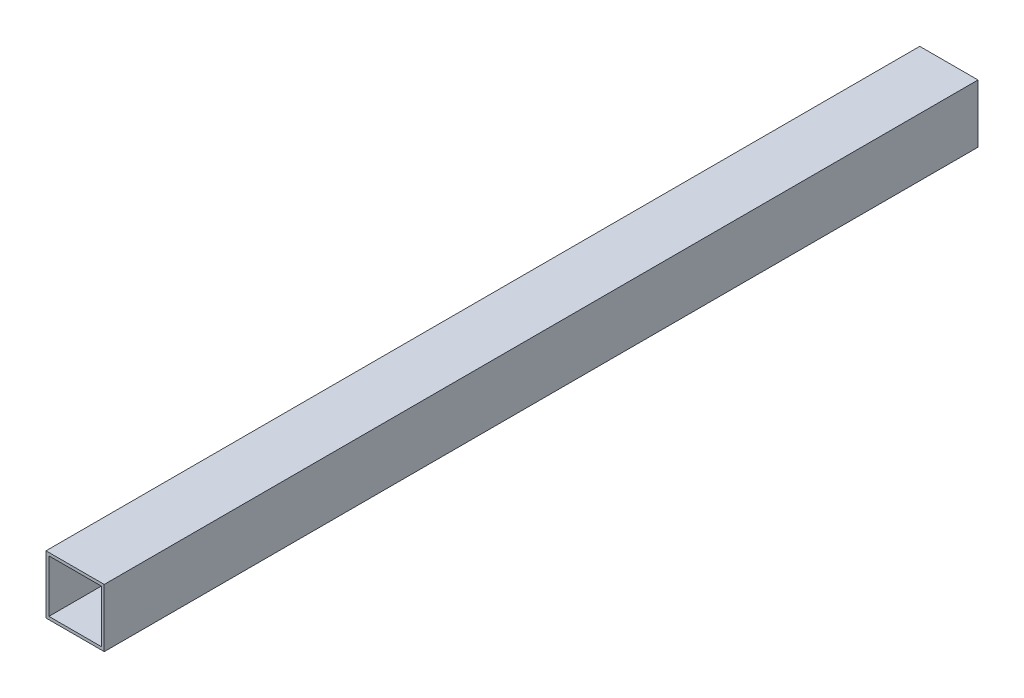
ISO-10303-21;
HEADER;
FILE_DESCRIPTION(('STEP AP214'),'2;1');
FILE_NAME('part.step','',(''),(''),'','','');
FILE_SCHEMA(('AUTOMOTIVE_DESIGN { 1 0 10303 214 1 1 1 1 }'));
ENDSEC;
DATA;
#1=APPLICATION_CONTEXT('core data for automotive mechanical design processes');
#2=APPLICATION_PROTOCOL_DEFINITION('international standard','automotive_design',2000,#1);
#3=PRODUCT_CONTEXT('',#1,'mechanical');
#4=PRODUCT('Part','Part','',(#3));
#5=PRODUCT_RELATED_PRODUCT_CATEGORY('part','',(#4));
#6=PRODUCT_DEFINITION_FORMATION('','',#4);
#7=PRODUCT_DEFINITION_CONTEXT('part definition',#1,'design');
#8=PRODUCT_DEFINITION('design','',#6,#7);
#9=PRODUCT_DEFINITION_SHAPE('','',#8);
#10=(LENGTH_UNIT() NAMED_UNIT(*) SI_UNIT(.MILLI.,.METRE.));
#11=(NAMED_UNIT(*) PLANE_ANGLE_UNIT() SI_UNIT($,.RADIAN.));
#12=(NAMED_UNIT(*) SI_UNIT($,.STERADIAN.) SOLID_ANGLE_UNIT());
#13=UNCERTAINTY_MEASURE_WITH_UNIT(LENGTH_MEASURE(1.E-05),#10,'distance_accuracy_value','');
#14=(GEOMETRIC_REPRESENTATION_CONTEXT(3) GLOBAL_UNCERTAINTY_ASSIGNED_CONTEXT((#13)) GLOBAL_UNIT_ASSIGNED_CONTEXT((#10,
#11,#12)) REPRESENTATION_CONTEXT('',''));
#15=CARTESIAN_POINT('',(0.,0.,0.));
#16=DIRECTION('',(0.,0.,1.));
#17=DIRECTION('',(1.,0.,0.));
#18=AXIS2_PLACEMENT_3D('',#15,#16,#17);
#19=CARTESIAN_POINT('',(0.,0.,0.));
#20=DIRECTION('',(0.,0.,-1.));
#21=DIRECTION('',(-1.,0.,0.));
#22=AXIS2_PLACEMENT_3D('',#19,#20,#21);
#23=PLANE('',#22);
#24=DIRECTION('',(0.,1.,0.));
#25=VECTOR('',#24,1.);
#26=CARTESIAN_POINT('',(10.,-10.,0.));
#27=LINE('',#26,#25);
#28=CARTESIAN_POINT('',(10.,-10.,0.));
#29=VERTEX_POINT('',#28);
#30=CARTESIAN_POINT('',(10.,10.,0.));
#31=VERTEX_POINT('',#30);
#32=EDGE_CURVE('E121',#29,#31,#27,.T.);
#33=ORIENTED_EDGE('',*,*,#32,.F.);
#34=DIRECTION('',(1.,0.,0.));
#35=VECTOR('',#34,1.);
#36=CARTESIAN_POINT('',(-10.,-10.,0.));
#37=LINE('',#36,#35);
#38=CARTESIAN_POINT('',(-10.,-10.,0.));
#39=VERTEX_POINT('',#38);
#40=EDGE_CURVE('E69',#39,#29,#37,.T.);
#41=ORIENTED_EDGE('',*,*,#40,.F.);
#42=DIRECTION('',(0.,-1.,0.));
#43=VECTOR('',#42,1.);
#44=CARTESIAN_POINT('',(-10.,-10.,0.));
#45=LINE('',#44,#43);
#46=CARTESIAN_POINT('',(-10.,10.,0.));
#47=VERTEX_POINT('',#46);
#48=EDGE_CURVE('E185',#47,#39,#45,.T.);
#49=ORIENTED_EDGE('',*,*,#48,.F.);
#50=DIRECTION('',(-1.,0.,0.));
#51=VECTOR('',#50,1.);
#52=CARTESIAN_POINT('',(-10.,10.,0.));
#53=LINE('',#52,#51);
#54=EDGE_CURVE('E182',#31,#47,#53,.T.);
#55=ORIENTED_EDGE('',*,*,#54,.F.);
#56=EDGE_LOOP('',(#33,#41,#49,#55));
#57=FACE_BOUND('',#56,.T.);
#58=DIRECTION('',(-1.,0.,0.));
#59=VECTOR('',#58,1.);
#60=CARTESIAN_POINT('',(-9.,9.,0.));
#61=LINE('',#60,#59);
#62=CARTESIAN_POINT('',(9.,9.,0.));
#63=VERTEX_POINT('',#62);
#64=CARTESIAN_POINT('',(-9.,9.,0.));
#65=VERTEX_POINT('',#64);
#66=EDGE_CURVE('E168',#63,#65,#61,.T.);
#67=ORIENTED_EDGE('',*,*,#66,.T.);
#68=DIRECTION('',(0.,-1.,0.));
#69=VECTOR('',#68,1.);
#70=CARTESIAN_POINT('',(-9.,-9.,0.));
#71=LINE('',#70,#69);
#72=CARTESIAN_POINT('',(-9.,-9.,0.));
#73=VERTEX_POINT('',#72);
#74=EDGE_CURVE('E61',#65,#73,#71,.T.);
#75=ORIENTED_EDGE('',*,*,#74,.T.);
#76=DIRECTION('',(1.,0.,0.));
#77=VECTOR('',#76,1.);
#78=CARTESIAN_POINT('',(-9.,-9.,0.));
#79=LINE('',#78,#77);
#80=CARTESIAN_POINT('',(9.,-9.,0.));
#81=VERTEX_POINT('',#80);
#82=EDGE_CURVE('E119',#73,#81,#79,.T.);
#83=ORIENTED_EDGE('',*,*,#82,.T.);
#84=DIRECTION('',(0.,1.,0.));
#85=VECTOR('',#84,1.);
#86=CARTESIAN_POINT('',(9.,-9.,0.));
#87=LINE('',#86,#85);
#88=EDGE_CURVE('E164',#81,#63,#87,.T.);
#89=ORIENTED_EDGE('',*,*,#88,.T.);
#90=EDGE_LOOP('',(#67,#75,#83,#89));
#91=FACE_BOUND('',#90,.T.);
#92=ADVANCED_FACE('F45',(#57,#91),#23,.T.);
#93=CARTESIAN_POINT('',(10.,-10.,150.));
#94=DIRECTION('',(-1.,0.,0.));
#95=DIRECTION('',(0.,0.,1.));
#96=AXIS2_PLACEMENT_3D('',#93,#94,#95);
#97=PLANE('',#96);
#98=ORIENTED_EDGE('',*,*,#32,.T.);
#99=DIRECTION('',(0.,0.,-1.));
#100=VECTOR('',#99,1.);
#101=CARTESIAN_POINT('',(10.,10.,150.));
#102=LINE('',#101,#100);
#103=CARTESIAN_POINT('',(10.,10.,300.));
#104=VERTEX_POINT('',#103);
#105=EDGE_CURVE('E11',#104,#31,#102,.T.);
#106=ORIENTED_EDGE('',*,*,#105,.F.);
#107=DIRECTION('',(0.,1.,0.));
#108=VECTOR('',#107,1.);
#109=CARTESIAN_POINT('',(10.,10.,300.));
#110=LINE('',#109,#108);
#111=CARTESIAN_POINT('',(10.,-10.,300.));
#112=VERTEX_POINT('',#111);
#113=EDGE_CURVE('E152',#112,#104,#110,.T.);
#114=ORIENTED_EDGE('',*,*,#113,.F.);
#115=DIRECTION('',(0.,0.,-1.));
#116=VECTOR('',#115,1.);
#117=CARTESIAN_POINT('',(10.,-10.,150.));
#118=LINE('',#117,#116);
#119=EDGE_CURVE('E190',#112,#29,#118,.T.);
#120=ORIENTED_EDGE('',*,*,#119,.T.);
#121=EDGE_LOOP('',(#98,#106,#114,#120));
#122=FACE_BOUND('',#121,.T.);
#123=ADVANCED_FACE('F47',(#122),#97,.F.);
#124=CARTESIAN_POINT('',(-10.,10.,150.));
#125=DIRECTION('',(0.,-1.,0.));
#126=DIRECTION('',(0.,0.,-1.));
#127=AXIS2_PLACEMENT_3D('',#124,#125,#126);
#128=PLANE('',#127);
#129=ORIENTED_EDGE('',*,*,#54,.T.);
#130=DIRECTION('',(0.,0.,-1.));
#131=VECTOR('',#130,1.);
#132=CARTESIAN_POINT('',(-10.,10.,150.));
#133=LINE('',#132,#131);
#134=CARTESIAN_POINT('',(-10.,10.,300.));
#135=VERTEX_POINT('',#134);
#136=EDGE_CURVE('E54',#135,#47,#133,.T.);
#137=ORIENTED_EDGE('',*,*,#136,.F.);
#138=DIRECTION('',(-1.,0.,0.));
#139=VECTOR('',#138,1.);
#140=CARTESIAN_POINT('',(-10.,10.,300.));
#141=LINE('',#140,#139);
#142=EDGE_CURVE('E156',#104,#135,#141,.T.);
#143=ORIENTED_EDGE('',*,*,#142,.F.);
#144=ORIENTED_EDGE('',*,*,#105,.T.);
#145=EDGE_LOOP('',(#129,#137,#143,#144));
#146=FACE_BOUND('',#145,.T.);
#147=ADVANCED_FACE('F211',(#146),#128,.F.);
#148=CARTESIAN_POINT('',(-10.,-10.,150.));
#149=DIRECTION('',(1.,0.,0.));
#150=DIRECTION('',(0.,0.,-1.));
#151=AXIS2_PLACEMENT_3D('',#148,#149,#150);
#152=PLANE('',#151);
#153=ORIENTED_EDGE('',*,*,#48,.T.);
#154=DIRECTION('',(0.,0.,-1.));
#155=VECTOR('',#154,1.);
#156=CARTESIAN_POINT('',(-10.,-10.,150.));
#157=LINE('',#156,#155);
#158=CARTESIAN_POINT('',(-10.,-10.,300.));
#159=VERTEX_POINT('',#158);
#160=EDGE_CURVE('E193',#159,#39,#157,.T.);
#161=ORIENTED_EDGE('',*,*,#160,.F.);
#162=DIRECTION('',(0.,-1.,0.));
#163=VECTOR('',#162,1.);
#164=CARTESIAN_POINT('',(-10.,10.,300.));
#165=LINE('',#164,#163);
#166=EDGE_CURVE('E144',#135,#159,#165,.T.);
#167=ORIENTED_EDGE('',*,*,#166,.F.);
#168=ORIENTED_EDGE('',*,*,#136,.T.);
#169=EDGE_LOOP('',(#153,#161,#167,#168));
#170=FACE_BOUND('',#169,.T.);
#171=ADVANCED_FACE('F200',(#170),#152,.F.);
#172=CARTESIAN_POINT('',(-10.,-10.,150.));
#173=DIRECTION('',(0.,1.,0.));
#174=DIRECTION('',(0.,0.,1.));
#175=AXIS2_PLACEMENT_3D('',#172,#173,#174);
#176=PLANE('',#175);
#177=ORIENTED_EDGE('',*,*,#40,.T.);
#178=ORIENTED_EDGE('',*,*,#119,.F.);
#179=DIRECTION('',(1.,0.,0.));
#180=VECTOR('',#179,1.);
#181=CARTESIAN_POINT('',(-10.,-10.,300.));
#182=LINE('',#181,#180);
#183=EDGE_CURVE('E148',#159,#112,#182,.T.);
#184=ORIENTED_EDGE('',*,*,#183,.F.);
#185=ORIENTED_EDGE('',*,*,#160,.T.);
#186=EDGE_LOOP('',(#177,#178,#184,#185));
#187=FACE_BOUND('',#186,.T.);
#188=ADVANCED_FACE('F209',(#187),#176,.F.);
#189=CARTESIAN_POINT('',(-9.,-9.,150.));
#190=DIRECTION('',(1.,0.,0.));
#191=DIRECTION('',(0.,0.,-1.));
#192=AXIS2_PLACEMENT_3D('',#189,#190,#191);
#193=PLANE('',#192);
#194=ORIENTED_EDGE('',*,*,#74,.F.);
#195=DIRECTION('',(0.,0.,-1.));
#196=VECTOR('',#195,1.);
#197=CARTESIAN_POINT('',(-9.,9.,150.));
#198=LINE('',#197,#196);
#199=CARTESIAN_POINT('',(-9.,9.,300.));
#200=VERTEX_POINT('',#199);
#201=EDGE_CURVE('E127',#200,#65,#198,.T.);
#202=ORIENTED_EDGE('',*,*,#201,.F.);
#203=DIRECTION('',(0.,-1.,0.));
#204=VECTOR('',#203,1.);
#205=CARTESIAN_POINT('',(-9.,9.,300.));
#206=LINE('',#205,#204);
#207=CARTESIAN_POINT('',(-9.,-9.,300.));
#208=VERTEX_POINT('',#207);
#209=EDGE_CURVE('E125',#200,#208,#206,.T.);
#210=ORIENTED_EDGE('',*,*,#209,.T.);
#211=DIRECTION('',(0.,0.,-1.));
#212=VECTOR('',#211,1.);
#213=CARTESIAN_POINT('',(-9.,-9.,150.));
#214=LINE('',#213,#212);
#215=EDGE_CURVE('E112',#208,#73,#214,.T.);
#216=ORIENTED_EDGE('',*,*,#215,.T.);
#217=EDGE_LOOP('',(#194,#202,#210,#216));
#218=FACE_BOUND('',#217,.T.);
#219=ADVANCED_FACE('F126',(#218),#193,.T.);
#220=CARTESIAN_POINT('',(-9.,-9.,150.));
#221=DIRECTION('',(0.,1.,0.));
#222=DIRECTION('',(0.,0.,1.));
#223=AXIS2_PLACEMENT_3D('',#220,#221,#222);
#224=PLANE('',#223);
#225=ORIENTED_EDGE('',*,*,#82,.F.);
#226=ORIENTED_EDGE('',*,*,#215,.F.);
#227=DIRECTION('',(1.,0.,0.));
#228=VECTOR('',#227,1.);
#229=CARTESIAN_POINT('',(-9.,-9.,300.));
#230=LINE('',#229,#228);
#231=CARTESIAN_POINT('',(9.,-9.,300.));
#232=VERTEX_POINT('',#231);
#233=EDGE_CURVE('E116',#208,#232,#230,.T.);
#234=ORIENTED_EDGE('',*,*,#233,.T.);
#235=DIRECTION('',(0.,0.,-1.));
#236=VECTOR('',#235,1.);
#237=CARTESIAN_POINT('',(9.,-9.,150.));
#238=LINE('',#237,#236);
#239=EDGE_CURVE('E122',#232,#81,#238,.T.);
#240=ORIENTED_EDGE('',*,*,#239,.T.);
#241=EDGE_LOOP('',(#225,#226,#234,#240));
#242=FACE_BOUND('',#241,.T.);
#243=ADVANCED_FACE('F114',(#242),#224,.T.);
#244=CARTESIAN_POINT('',(9.,-9.,150.));
#245=DIRECTION('',(-1.,0.,0.));
#246=DIRECTION('',(0.,-1.,0.));
#247=AXIS2_PLACEMENT_3D('',#244,#245,#246);
#248=PLANE('',#247);
#249=ORIENTED_EDGE('',*,*,#88,.F.);
#250=ORIENTED_EDGE('',*,*,#239,.F.);
#251=DIRECTION('',(0.,1.,0.));
#252=VECTOR('',#251,1.);
#253=CARTESIAN_POINT('',(9.,9.,300.));
#254=LINE('',#253,#252);
#255=CARTESIAN_POINT('',(9.,9.,300.));
#256=VERTEX_POINT('',#255);
#257=EDGE_CURVE('E135',#232,#256,#254,.T.);
#258=ORIENTED_EDGE('',*,*,#257,.T.);
#259=DIRECTION('',(0.,0.,-1.));
#260=VECTOR('',#259,1.);
#261=CARTESIAN_POINT('',(9.,9.,150.));
#262=LINE('',#261,#260);
#263=EDGE_CURVE('E174',#256,#63,#262,.T.);
#264=ORIENTED_EDGE('',*,*,#263,.T.);
#265=EDGE_LOOP('',(#249,#250,#258,#264));
#266=FACE_BOUND('',#265,.T.);
#267=ADVANCED_FACE('F232',(#266),#248,.T.);
#268=CARTESIAN_POINT('',(-9.,9.,150.));
#269=DIRECTION('',(0.,-1.,0.));
#270=DIRECTION('',(0.,0.,-1.));
#271=AXIS2_PLACEMENT_3D('',#268,#269,#270);
#272=PLANE('',#271);
#273=ORIENTED_EDGE('',*,*,#66,.F.);
#274=ORIENTED_EDGE('',*,*,#263,.F.);
#275=DIRECTION('',(-1.,0.,0.));
#276=VECTOR('',#275,1.);
#277=CARTESIAN_POINT('',(-9.,9.,300.));
#278=LINE('',#277,#276);
#279=EDGE_CURVE('E139',#256,#200,#278,.T.);
#280=ORIENTED_EDGE('',*,*,#279,.T.);
#281=ORIENTED_EDGE('',*,*,#201,.T.);
#282=EDGE_LOOP('',(#273,#274,#280,#281));
#283=FACE_BOUND('',#282,.T.);
#284=ADVANCED_FACE('F236',(#283),#272,.T.);
#285=CARTESIAN_POINT('',(0.,0.,300.));
#286=DIRECTION('',(0.,0.,1.));
#287=DIRECTION('',(1.,0.,0.));
#288=AXIS2_PLACEMENT_3D('',#285,#286,#287);
#289=PLANE('',#288);
#290=ORIENTED_EDGE('',*,*,#166,.T.);
#291=ORIENTED_EDGE('',*,*,#183,.T.);
#292=ORIENTED_EDGE('',*,*,#113,.T.);
#293=ORIENTED_EDGE('',*,*,#142,.T.);
#294=EDGE_LOOP('',(#290,#291,#292,#293));
#295=FACE_BOUND('',#294,.T.);
#296=ORIENTED_EDGE('',*,*,#233,.F.);
#297=ORIENTED_EDGE('',*,*,#209,.F.);
#298=ORIENTED_EDGE('',*,*,#279,.F.);
#299=ORIENTED_EDGE('',*,*,#257,.F.);
#300=EDGE_LOOP('',(#296,#297,#298,#299));
#301=FACE_BOUND('',#300,.T.);
#302=ADVANCED_FACE('F133',(#295,#301),#289,.T.);
#303=CLOSED_SHELL('',(#92,#123,#147,#171,#188,#219,#243,#267,#284,#302));
#304=MANIFOLD_SOLID_BREP('B2',#303);
#305=ADVANCED_BREP_SHAPE_REPRESENTATION('',(#18,#304),#14);
#306=SHAPE_DEFINITION_REPRESENTATION(#9,#305);
ENDSEC;
END-ISO-10303-21;
